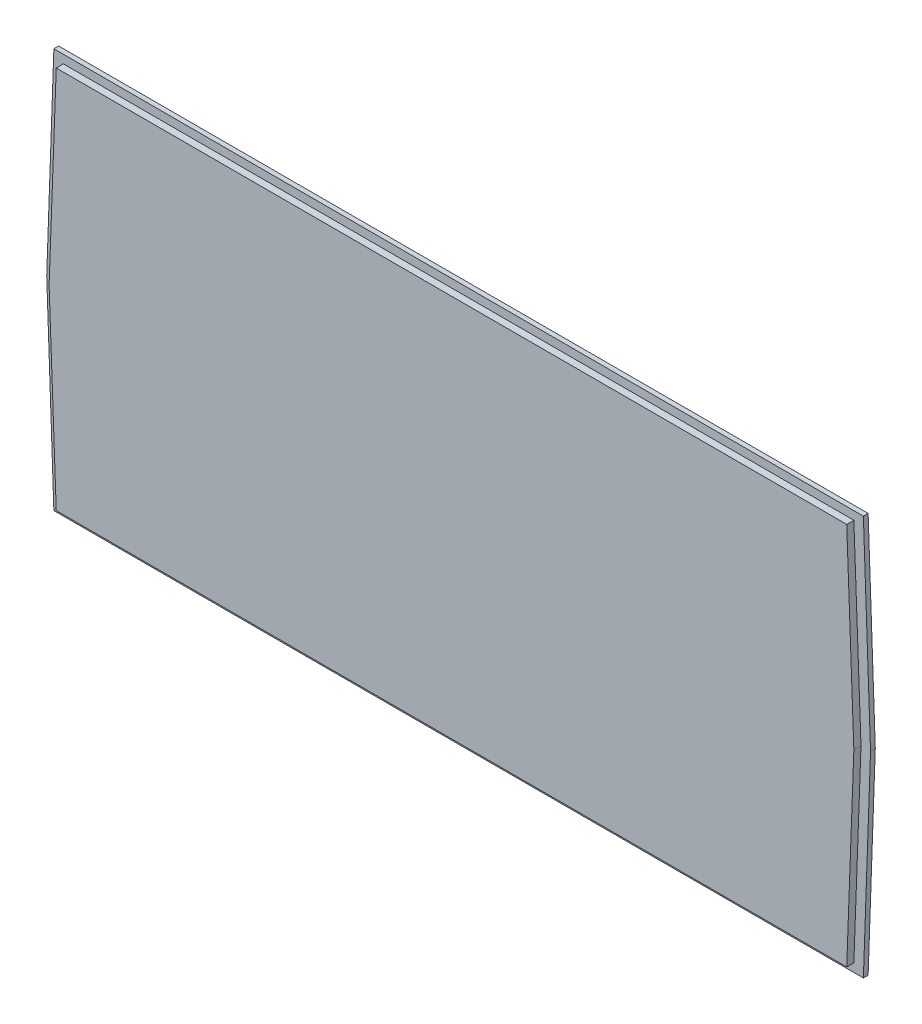
ISO-10303-21;
HEADER;
FILE_DESCRIPTION(('STEP AP214'),'2;1');
FILE_NAME('part.step','',(''),(''),'','','');
FILE_SCHEMA(('AUTOMOTIVE_DESIGN { 1 0 10303 214 1 1 1 1 }'));
ENDSEC;
DATA;
#1=APPLICATION_CONTEXT('core data for automotive mechanical design processes');
#2=APPLICATION_PROTOCOL_DEFINITION('international standard','automotive_design',2000,#1);
#3=PRODUCT_CONTEXT('',#1,'mechanical');
#4=PRODUCT('Part','Part','',(#3));
#5=PRODUCT_RELATED_PRODUCT_CATEGORY('part','',(#4));
#6=PRODUCT_DEFINITION_FORMATION('','',#4);
#7=PRODUCT_DEFINITION_CONTEXT('part definition',#1,'design');
#8=PRODUCT_DEFINITION('design','',#6,#7);
#9=PRODUCT_DEFINITION_SHAPE('','',#8);
#10=(LENGTH_UNIT() NAMED_UNIT(*) SI_UNIT(.MILLI.,.METRE.));
#11=(NAMED_UNIT(*) PLANE_ANGLE_UNIT() SI_UNIT($,.RADIAN.));
#12=(NAMED_UNIT(*) SI_UNIT($,.STERADIAN.) SOLID_ANGLE_UNIT());
#13=UNCERTAINTY_MEASURE_WITH_UNIT(LENGTH_MEASURE(1.E-05),#10,'distance_accuracy_value','');
#14=(GEOMETRIC_REPRESENTATION_CONTEXT(3) GLOBAL_UNCERTAINTY_ASSIGNED_CONTEXT((#13)) GLOBAL_UNIT_ASSIGNED_CONTEXT((#10,
#11,#12)) REPRESENTATION_CONTEXT('',''));
#15=CARTESIAN_POINT('',(0.,0.,0.));
#16=DIRECTION('',(0.,0.,1.));
#17=DIRECTION('',(1.,0.,0.));
#18=AXIS2_PLACEMENT_3D('',#15,#16,#17);
#19=CARTESIAN_POINT('',(0.,0.,1.));
#20=DIRECTION('',(0.,0.,-1.));
#21=DIRECTION('',(-1.,0.,0.));
#22=AXIS2_PLACEMENT_3D('',#19,#20,#21);
#23=PLANE('',#22);
#24=DIRECTION('',(0.0356915305124112,0.99936285434755,0.));
#25=VECTOR('',#24,1.);
#26=CARTESIAN_POINT('',(85.,-42.,1.));
#27=LINE('',#26,#25);
#28=CARTESIAN_POINT('',(85.,-42.,1.));
#29=VERTEX_POINT('',#28);
#30=CARTESIAN_POINT('',(86.5,0.,1.));
#31=VERTEX_POINT('',#30);
#32=EDGE_CURVE('E152',#29,#31,#27,.T.);
#33=ORIENTED_EDGE('',*,*,#32,.T.);
#34=DIRECTION('',(-0.0356915305124112,0.99936285434755,0.));
#35=VECTOR('',#34,1.);
#36=CARTESIAN_POINT('',(85.,42.,1.));
#37=LINE('',#36,#35);
#38=CARTESIAN_POINT('',(85.,42.,1.));
#39=VERTEX_POINT('',#38);
#40=EDGE_CURVE('E155',#31,#39,#37,.T.);
#41=ORIENTED_EDGE('',*,*,#40,.T.);
#42=DIRECTION('',(-1.,0.,0.));
#43=VECTOR('',#42,1.);
#44=CARTESIAN_POINT('',(-85.,42.,1.));
#45=LINE('',#44,#43);
#46=CARTESIAN_POINT('',(-85.,42.,1.));
#47=VERTEX_POINT('',#46);
#48=EDGE_CURVE('E158',#39,#47,#45,.T.);
#49=ORIENTED_EDGE('',*,*,#48,.T.);
#50=DIRECTION('',(-0.0356915305124132,-0.999362854347549,0.));
#51=VECTOR('',#50,1.);
#52=CARTESIAN_POINT('',(-85.,42.,1.));
#53=LINE('',#52,#51);
#54=CARTESIAN_POINT('',(-86.5,0.,1.));
#55=VERTEX_POINT('',#54);
#56=EDGE_CURVE('E160',#47,#55,#53,.T.);
#57=ORIENTED_EDGE('',*,*,#56,.T.);
#58=DIRECTION('',(0.0356915305124132,-0.99936285434755,0.));
#59=VECTOR('',#58,1.);
#60=CARTESIAN_POINT('',(-86.5,0.,1.));
#61=LINE('',#60,#59);
#62=CARTESIAN_POINT('',(-85.,-42.,1.));
#63=VERTEX_POINT('',#62);
#64=EDGE_CURVE('E162',#55,#63,#61,.T.);
#65=ORIENTED_EDGE('',*,*,#64,.T.);
#66=DIRECTION('',(1.,0.,0.));
#67=VECTOR('',#66,1.);
#68=CARTESIAN_POINT('',(-85.,-42.,1.));
#69=LINE('',#68,#67);
#70=EDGE_CURVE('E164',#63,#29,#69,.T.);
#71=ORIENTED_EDGE('',*,*,#70,.T.);
#72=EDGE_LOOP('',(#33,#41,#49,#57,#65,#71));
#73=FACE_BOUND('',#72,.T.);
#74=DIRECTION('',(0.0372412287515797,0.999306304834045,0.));
#75=VECTOR('',#74,1.);
#76=CARTESIAN_POINT('',(83.,-40.25,1.));
#77=LINE('',#76,#75);
#78=CARTESIAN_POINT('',(83.,-40.25,1.));
#79=VERTEX_POINT('',#78);
#80=CARTESIAN_POINT('',(84.5,0.,1.));
#81=VERTEX_POINT('',#80);
#82=EDGE_CURVE('E142',#79,#81,#77,.T.);
#83=ORIENTED_EDGE('',*,*,#82,.F.);
#84=DIRECTION('',(1.,0.,0.));
#85=VECTOR('',#84,1.);
#86=CARTESIAN_POINT('',(-83.,-40.25,1.));
#87=LINE('',#86,#85);
#88=CARTESIAN_POINT('',(-83.,-40.25,1.));
#89=VERTEX_POINT('',#88);
#90=EDGE_CURVE('E139',#89,#79,#87,.T.);
#91=ORIENTED_EDGE('',*,*,#90,.F.);
#92=DIRECTION('',(0.037241228751579,-0.999306304834044,0.));
#93=VECTOR('',#92,1.);
#94=CARTESIAN_POINT('',(-83.,-40.25,1.));
#95=LINE('',#94,#93);
#96=CARTESIAN_POINT('',(-84.5,0.,1.));
#97=VERTEX_POINT('',#96);
#98=EDGE_CURVE('E348',#97,#89,#95,.T.);
#99=ORIENTED_EDGE('',*,*,#98,.F.);
#100=DIRECTION('',(-0.037241228751579,-0.999306304834044,0.));
#101=VECTOR('',#100,1.);
#102=CARTESIAN_POINT('',(-84.5,0.,1.));
#103=LINE('',#102,#101);
#104=CARTESIAN_POINT('',(-83.,40.25,1.));
#105=VERTEX_POINT('',#104);
#106=EDGE_CURVE('E363',#105,#97,#103,.T.);
#107=ORIENTED_EDGE('',*,*,#106,.F.);
#108=DIRECTION('',(-1.,0.,0.));
#109=VECTOR('',#108,1.);
#110=CARTESIAN_POINT('',(-83.,40.25,1.));
#111=LINE('',#110,#109);
#112=CARTESIAN_POINT('',(83.,40.25,1.));
#113=VERTEX_POINT('',#112);
#114=EDGE_CURVE('E53',#113,#105,#111,.T.);
#115=ORIENTED_EDGE('',*,*,#114,.F.);
#116=DIRECTION('',(-0.0372412287515797,0.999306304834045,0.));
#117=VECTOR('',#116,1.);
#118=CARTESIAN_POINT('',(84.5,0.,1.));
#119=LINE('',#118,#117);
#120=EDGE_CURVE('E48',#81,#113,#119,.T.);
#121=ORIENTED_EDGE('',*,*,#120,.F.);
#122=EDGE_LOOP('',(#83,#91,#99,#107,#115,#121));
#123=FACE_BOUND('',#122,.T.);
#124=ADVANCED_FACE('F33',(#73,#123),#23,.F.);
#125=CARTESIAN_POINT('',(85.,-42.,1.));
#126=DIRECTION('',(-0.99936285434755,0.0356915305124112,0.));
#127=DIRECTION('',(-0.0356915305124112,-0.99936285434755,0.));
#128=AXIS2_PLACEMENT_3D('',#125,#126,#127);
#129=PLANE('',#128);
#130=DIRECTION('',(0.0356915305124112,0.99936285434755,0.));
#131=VECTOR('',#130,1.);
#132=CARTESIAN_POINT('',(85.,-42.,0.));
#133=LINE('',#132,#131);
#134=CARTESIAN_POINT('',(85.,-42.,0.));
#135=VERTEX_POINT('',#134);
#136=CARTESIAN_POINT('',(86.5,0.,0.));
#137=VERTEX_POINT('',#136);
#138=EDGE_CURVE('E143',#135,#137,#133,.T.);
#139=ORIENTED_EDGE('',*,*,#138,.T.);
#140=DIRECTION('',(0.,0.,-1.));
#141=VECTOR('',#140,1.);
#142=CARTESIAN_POINT('',(86.5,0.,1.));
#143=LINE('',#142,#141);
#144=EDGE_CURVE('E11',#31,#137,#143,.T.);
#145=ORIENTED_EDGE('',*,*,#144,.F.);
#146=ORIENTED_EDGE('',*,*,#32,.F.);
#147=DIRECTION('',(0.,0.,-1.));
#148=VECTOR('',#147,1.);
#149=CARTESIAN_POINT('',(85.,-42.,1.));
#150=LINE('',#149,#148);
#151=EDGE_CURVE('E165',#29,#135,#150,.T.);
#152=ORIENTED_EDGE('',*,*,#151,.T.);
#153=EDGE_LOOP('',(#139,#145,#146,#152));
#154=FACE_BOUND('',#153,.T.);
#155=ADVANCED_FACE('F35',(#154),#129,.F.);
#156=CARTESIAN_POINT('',(85.,42.,1.));
#157=DIRECTION('',(-0.99936285434755,-0.0356915305124112,0.));
#158=DIRECTION('',(0.0356915305124112,-0.99936285434755,0.));
#159=AXIS2_PLACEMENT_3D('',#156,#157,#158);
#160=PLANE('',#159);
#161=DIRECTION('',(-0.0356915305124112,0.99936285434755,0.));
#162=VECTOR('',#161,1.);
#163=CARTESIAN_POINT('',(85.,42.,0.));
#164=LINE('',#163,#162);
#165=CARTESIAN_POINT('',(85.,42.,0.));
#166=VERTEX_POINT('',#165);
#167=EDGE_CURVE('E146',#137,#166,#164,.T.);
#168=ORIENTED_EDGE('',*,*,#167,.T.);
#169=DIRECTION('',(0.,0.,-1.));
#170=VECTOR('',#169,1.);
#171=CARTESIAN_POINT('',(85.,42.,1.));
#172=LINE('',#171,#170);
#173=EDGE_CURVE('E41',#39,#166,#172,.T.);
#174=ORIENTED_EDGE('',*,*,#173,.F.);
#175=ORIENTED_EDGE('',*,*,#40,.F.);
#176=ORIENTED_EDGE('',*,*,#144,.T.);
#177=EDGE_LOOP('',(#168,#174,#175,#176));
#178=FACE_BOUND('',#177,.T.);
#179=ADVANCED_FACE('F212',(#178),#160,.F.);
#180=CARTESIAN_POINT('',(-85.,42.,1.));
#181=DIRECTION('',(0.,-1.,0.));
#182=DIRECTION('',(0.,0.,-1.));
#183=AXIS2_PLACEMENT_3D('',#180,#181,#182);
#184=PLANE('',#183);
#185=DIRECTION('',(-1.,0.,0.));
#186=VECTOR('',#185,1.);
#187=CARTESIAN_POINT('',(-85.,42.,0.));
#188=LINE('',#187,#186);
#189=CARTESIAN_POINT('',(-85.,42.,0.));
#190=VERTEX_POINT('',#189);
#191=EDGE_CURVE('E168',#166,#190,#188,.T.);
#192=ORIENTED_EDGE('',*,*,#191,.T.);
#193=DIRECTION('',(0.,0.,-1.));
#194=VECTOR('',#193,1.);
#195=CARTESIAN_POINT('',(-85.,42.,1.));
#196=LINE('',#195,#194);
#197=EDGE_CURVE('E183',#47,#190,#196,.T.);
#198=ORIENTED_EDGE('',*,*,#197,.F.);
#199=ORIENTED_EDGE('',*,*,#48,.F.);
#200=ORIENTED_EDGE('',*,*,#173,.T.);
#201=EDGE_LOOP('',(#192,#198,#199,#200));
#202=FACE_BOUND('',#201,.T.);
#203=ADVANCED_FACE('F190',(#202),#184,.F.);
#204=CARTESIAN_POINT('',(-85.,42.,1.));
#205=DIRECTION('',(0.999362854347549,-0.0356915305124132,0.));
#206=DIRECTION('',(0.0356915305124132,0.99936285434755,0.));
#207=AXIS2_PLACEMENT_3D('',#204,#205,#206);
#208=PLANE('',#207);
#209=DIRECTION('',(-0.0356915305124132,-0.999362854347549,0.));
#210=VECTOR('',#209,1.);
#211=CARTESIAN_POINT('',(-85.,42.,0.));
#212=LINE('',#211,#210);
#213=CARTESIAN_POINT('',(-86.5,0.,0.));
#214=VERTEX_POINT('',#213);
#215=EDGE_CURVE('E170',#190,#214,#212,.T.);
#216=ORIENTED_EDGE('',*,*,#215,.T.);
#217=DIRECTION('',(0.,0.,-1.));
#218=VECTOR('',#217,1.);
#219=CARTESIAN_POINT('',(-86.5,0.,1.));
#220=LINE('',#219,#218);
#221=EDGE_CURVE('E180',#55,#214,#220,.T.);
#222=ORIENTED_EDGE('',*,*,#221,.F.);
#223=ORIENTED_EDGE('',*,*,#56,.F.);
#224=ORIENTED_EDGE('',*,*,#197,.T.);
#225=EDGE_LOOP('',(#216,#222,#223,#224));
#226=FACE_BOUND('',#225,.T.);
#227=ADVANCED_FACE('F201',(#226),#208,.F.);
#228=CARTESIAN_POINT('',(-86.5,0.,1.));
#229=DIRECTION('',(0.999362854347549,0.0356915305124132,0.));
#230=DIRECTION('',(-0.0356915305124132,0.99936285434755,0.));
#231=AXIS2_PLACEMENT_3D('',#228,#229,#230);
#232=PLANE('',#231);
#233=DIRECTION('',(0.0356915305124132,-0.99936285434755,0.));
#234=VECTOR('',#233,1.);
#235=CARTESIAN_POINT('',(-86.5,0.,0.));
#236=LINE('',#235,#234);
#237=CARTESIAN_POINT('',(-85.,-42.,0.));
#238=VERTEX_POINT('',#237);
#239=EDGE_CURVE('E172',#214,#238,#236,.T.);
#240=ORIENTED_EDGE('',*,*,#239,.T.);
#241=DIRECTION('',(0.,0.,-1.));
#242=VECTOR('',#241,1.);
#243=CARTESIAN_POINT('',(-85.,-42.,1.));
#244=LINE('',#243,#242);
#245=EDGE_CURVE('E177',#63,#238,#244,.T.);
#246=ORIENTED_EDGE('',*,*,#245,.F.);
#247=ORIENTED_EDGE('',*,*,#64,.F.);
#248=ORIENTED_EDGE('',*,*,#221,.T.);
#249=EDGE_LOOP('',(#240,#246,#247,#248));
#250=FACE_BOUND('',#249,.T.);
#251=ADVANCED_FACE('F205',(#250),#232,.F.);
#252=CARTESIAN_POINT('',(-85.,-42.,1.));
#253=DIRECTION('',(0.,1.,0.));
#254=DIRECTION('',(0.,0.,1.));
#255=AXIS2_PLACEMENT_3D('',#252,#253,#254);
#256=PLANE('',#255);
#257=DIRECTION('',(1.,0.,0.));
#258=VECTOR('',#257,1.);
#259=CARTESIAN_POINT('',(-85.,-42.,0.));
#260=LINE('',#259,#258);
#261=EDGE_CURVE('E156',#238,#135,#260,.T.);
#262=ORIENTED_EDGE('',*,*,#261,.T.);
#263=ORIENTED_EDGE('',*,*,#151,.F.);
#264=ORIENTED_EDGE('',*,*,#70,.F.);
#265=ORIENTED_EDGE('',*,*,#245,.T.);
#266=EDGE_LOOP('',(#262,#263,#264,#265));
#267=FACE_BOUND('',#266,.T.);
#268=ADVANCED_FACE('F215',(#267),#256,.F.);
#269=CARTESIAN_POINT('',(0.,0.,0.));
#270=DIRECTION('',(0.,0.,-1.));
#271=DIRECTION('',(-1.,0.,0.));
#272=AXIS2_PLACEMENT_3D('',#269,#270,#271);
#273=PLANE('',#272);
#274=ORIENTED_EDGE('',*,*,#138,.F.);
#275=ORIENTED_EDGE('',*,*,#261,.F.);
#276=ORIENTED_EDGE('',*,*,#239,.F.);
#277=ORIENTED_EDGE('',*,*,#215,.F.);
#278=ORIENTED_EDGE('',*,*,#191,.F.);
#279=ORIENTED_EDGE('',*,*,#167,.F.);
#280=EDGE_LOOP('',(#274,#275,#276,#277,#278,#279));
#281=FACE_BOUND('',#280,.T.);
#282=ADVANCED_FACE('F196',(#281),#273,.T.);
#283=CARTESIAN_POINT('',(83.,-40.25,2.5));
#284=DIRECTION('',(-0.999306304834044,0.0372412287515797,0.));
#285=DIRECTION('',(-0.0372412287515797,-0.999306304834045,0.));
#286=AXIS2_PLACEMENT_3D('',#283,#284,#285);
#287=PLANE('',#286);
#288=ORIENTED_EDGE('',*,*,#82,.T.);
#289=DIRECTION('',(0.,0.,-1.));
#290=VECTOR('',#289,1.);
#291=CARTESIAN_POINT('',(84.5,0.,2.5));
#292=LINE('',#291,#290);
#293=CARTESIAN_POINT('',(84.5,0.,2.5));
#294=VERTEX_POINT('',#293);
#295=EDGE_CURVE('E123',#294,#81,#292,.T.);
#296=ORIENTED_EDGE('',*,*,#295,.F.);
#297=DIRECTION('',(0.0372412287515797,0.999306304834045,0.));
#298=VECTOR('',#297,1.);
#299=CARTESIAN_POINT('',(83.,-40.25,2.5));
#300=LINE('',#299,#298);
#301=CARTESIAN_POINT('',(83.,-40.25,2.5));
#302=VERTEX_POINT('',#301);
#303=EDGE_CURVE('E130',#302,#294,#300,.T.);
#304=ORIENTED_EDGE('',*,*,#303,.F.);
#305=DIRECTION('',(0.,0.,-1.));
#306=VECTOR('',#305,1.);
#307=CARTESIAN_POINT('',(83.,-40.25,2.5));
#308=LINE('',#307,#306);
#309=EDGE_CURVE('E344',#302,#79,#308,.T.);
#310=ORIENTED_EDGE('',*,*,#309,.T.);
#311=EDGE_LOOP('',(#288,#296,#304,#310));
#312=FACE_BOUND('',#311,.T.);
#313=ADVANCED_FACE('F141',(#312),#287,.F.);
#314=CARTESIAN_POINT('',(84.5,0.,2.5));
#315=DIRECTION('',(-0.999306304834044,-0.0372412287515797,0.));
#316=DIRECTION('',(0.0372412287515797,-0.999306304834045,0.));
#317=AXIS2_PLACEMENT_3D('',#314,#315,#316);
#318=PLANE('',#317);
#319=ORIENTED_EDGE('',*,*,#120,.T.);
#320=DIRECTION('',(0.,0.,-1.));
#321=VECTOR('',#320,1.);
#322=CARTESIAN_POINT('',(83.,40.25,2.5));
#323=LINE('',#322,#321);
#324=CARTESIAN_POINT('',(83.,40.25,2.5));
#325=VERTEX_POINT('',#324);
#326=EDGE_CURVE('E126',#325,#113,#323,.T.);
#327=ORIENTED_EDGE('',*,*,#326,.F.);
#328=DIRECTION('',(-0.0372412287515797,0.999306304834045,0.));
#329=VECTOR('',#328,1.);
#330=CARTESIAN_POINT('',(84.5,0.,2.5));
#331=LINE('',#330,#329);
#332=EDGE_CURVE('E119',#294,#325,#331,.T.);
#333=ORIENTED_EDGE('',*,*,#332,.F.);
#334=ORIENTED_EDGE('',*,*,#295,.T.);
#335=EDGE_LOOP('',(#319,#327,#333,#334));
#336=FACE_BOUND('',#335,.T.);
#337=ADVANCED_FACE('F121',(#336),#318,.F.);
#338=CARTESIAN_POINT('',(-83.,40.25,2.5));
#339=DIRECTION('',(0.,-1.,0.));
#340=DIRECTION('',(0.,0.,-1.));
#341=AXIS2_PLACEMENT_3D('',#338,#339,#340);
#342=PLANE('',#341);
#343=ORIENTED_EDGE('',*,*,#114,.T.);
#344=DIRECTION('',(0.,0.,-1.));
#345=VECTOR('',#344,1.);
#346=CARTESIAN_POINT('',(-83.,40.25,2.5));
#347=LINE('',#346,#345);
#348=CARTESIAN_POINT('',(-83.,40.25,2.5));
#349=VERTEX_POINT('',#348);
#350=EDGE_CURVE('E148',#349,#105,#347,.T.);
#351=ORIENTED_EDGE('',*,*,#350,.F.);
#352=DIRECTION('',(-1.,0.,0.));
#353=VECTOR('',#352,1.);
#354=CARTESIAN_POINT('',(-83.,40.25,2.5));
#355=LINE('',#354,#353);
#356=EDGE_CURVE('E129',#325,#349,#355,.T.);
#357=ORIENTED_EDGE('',*,*,#356,.F.);
#358=ORIENTED_EDGE('',*,*,#326,.T.);
#359=EDGE_LOOP('',(#343,#351,#357,#358));
#360=FACE_BOUND('',#359,.T.);
#361=ADVANCED_FACE('F234',(#360),#342,.F.);
#362=CARTESIAN_POINT('',(-84.5,0.,2.5));
#363=DIRECTION('',(0.999306304834045,-0.037241228751579,0.));
#364=DIRECTION('',(0.037241228751579,0.999306304834045,0.));
#365=AXIS2_PLACEMENT_3D('',#362,#363,#364);
#366=PLANE('',#365);
#367=ORIENTED_EDGE('',*,*,#106,.T.);
#368=DIRECTION('',(0.,0.,-1.));
#369=VECTOR('',#368,1.);
#370=CARTESIAN_POINT('',(-84.5,0.,2.5));
#371=LINE('',#370,#369);
#372=CARTESIAN_POINT('',(-84.5,0.,2.5));
#373=VERTEX_POINT('',#372);
#374=EDGE_CURVE('E351',#373,#97,#371,.T.);
#375=ORIENTED_EDGE('',*,*,#374,.F.);
#376=DIRECTION('',(-0.037241228751579,-0.999306304834044,0.));
#377=VECTOR('',#376,1.);
#378=CARTESIAN_POINT('',(-84.5,0.,2.5));
#379=LINE('',#378,#377);
#380=EDGE_CURVE('E364',#349,#373,#379,.T.);
#381=ORIENTED_EDGE('',*,*,#380,.F.);
#382=ORIENTED_EDGE('',*,*,#350,.T.);
#383=EDGE_LOOP('',(#367,#375,#381,#382));
#384=FACE_BOUND('',#383,.T.);
#385=ADVANCED_FACE('F237',(#384),#366,.F.);
#386=CARTESIAN_POINT('',(-83.,-40.25,2.5));
#387=DIRECTION('',(0.999306304834045,0.037241228751579,0.));
#388=DIRECTION('',(-0.037241228751579,0.999306304834045,0.));
#389=AXIS2_PLACEMENT_3D('',#386,#387,#388);
#390=PLANE('',#389);
#391=ORIENTED_EDGE('',*,*,#98,.T.);
#392=DIRECTION('',(0.,0.,-1.));
#393=VECTOR('',#392,1.);
#394=CARTESIAN_POINT('',(-83.,-40.25,2.5));
#395=LINE('',#394,#393);
#396=CARTESIAN_POINT('',(-83.,-40.25,2.5));
#397=VERTEX_POINT('',#396);
#398=EDGE_CURVE('E346',#397,#89,#395,.T.);
#399=ORIENTED_EDGE('',*,*,#398,.F.);
#400=DIRECTION('',(0.037241228751579,-0.999306304834044,0.));
#401=VECTOR('',#400,1.);
#402=CARTESIAN_POINT('',(-83.,-40.25,2.5));
#403=LINE('',#402,#401);
#404=EDGE_CURVE('E353',#373,#397,#403,.T.);
#405=ORIENTED_EDGE('',*,*,#404,.F.);
#406=ORIENTED_EDGE('',*,*,#374,.T.);
#407=EDGE_LOOP('',(#391,#399,#405,#406));
#408=FACE_BOUND('',#407,.T.);
#409=ADVANCED_FACE('F241',(#408),#390,.F.);
#410=CARTESIAN_POINT('',(-83.,-40.25,2.5));
#411=DIRECTION('',(0.,1.,0.));
#412=DIRECTION('',(0.,0.,1.));
#413=AXIS2_PLACEMENT_3D('',#410,#411,#412);
#414=PLANE('',#413);
#415=ORIENTED_EDGE('',*,*,#90,.T.);
#416=ORIENTED_EDGE('',*,*,#309,.F.);
#417=DIRECTION('',(1.,0.,0.));
#418=VECTOR('',#417,1.);
#419=CARTESIAN_POINT('',(-83.,-40.25,2.5));
#420=LINE('',#419,#418);
#421=EDGE_CURVE('E135',#397,#302,#420,.T.);
#422=ORIENTED_EDGE('',*,*,#421,.F.);
#423=ORIENTED_EDGE('',*,*,#398,.T.);
#424=EDGE_LOOP('',(#415,#416,#422,#423));
#425=FACE_BOUND('',#424,.T.);
#426=ADVANCED_FACE('F245',(#425),#414,.F.);
#427=CARTESIAN_POINT('',(0.,0.,2.5));
#428=DIRECTION('',(0.,0.,-1.));
#429=DIRECTION('',(-1.,0.,0.));
#430=AXIS2_PLACEMENT_3D('',#427,#428,#429);
#431=PLANE('',#430);
#432=ORIENTED_EDGE('',*,*,#303,.T.);
#433=ORIENTED_EDGE('',*,*,#332,.T.);
#434=ORIENTED_EDGE('',*,*,#356,.T.);
#435=ORIENTED_EDGE('',*,*,#380,.T.);
#436=ORIENTED_EDGE('',*,*,#404,.T.);
#437=ORIENTED_EDGE('',*,*,#421,.T.);
#438=EDGE_LOOP('',(#432,#433,#434,#435,#436,#437));
#439=FACE_BOUND('',#438,.T.);
#440=ADVANCED_FACE('F133',(#439),#431,.F.);
#441=CLOSED_SHELL('',(#124,#155,#179,#203,#227,#251,#268,#282,#313,#337,#361,#385,#409,#426,#440));
#442=MANIFOLD_SOLID_BREP('B2',#441);
#443=ADVANCED_BREP_SHAPE_REPRESENTATION('',(#18,#442),#14);
#444=SHAPE_DEFINITION_REPRESENTATION(#9,#443);
ENDSEC;
END-ISO-10303-21;
